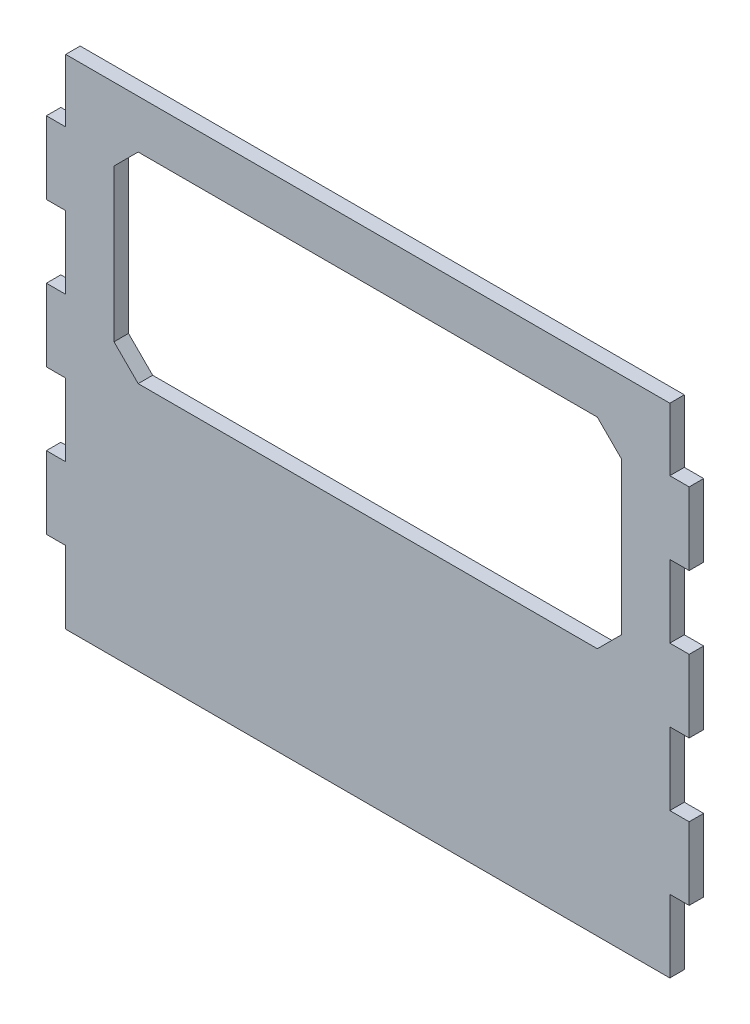
ISO-10303-21;
HEADER;
FILE_DESCRIPTION(('STEP AP214'),'2;1');
FILE_NAME('part.step','',(''),(''),'','','');
FILE_SCHEMA(('AUTOMOTIVE_DESIGN { 1 0 10303 214 1 1 1 1 }'));
ENDSEC;
DATA;
#1=APPLICATION_CONTEXT('core data for automotive mechanical design processes');
#2=APPLICATION_PROTOCOL_DEFINITION('international standard','automotive_design',2000,#1);
#3=PRODUCT_CONTEXT('',#1,'mechanical');
#4=PRODUCT('Part','Part','',(#3));
#5=PRODUCT_RELATED_PRODUCT_CATEGORY('part','',(#4));
#6=PRODUCT_DEFINITION_FORMATION('','',#4);
#7=PRODUCT_DEFINITION_CONTEXT('part definition',#1,'design');
#8=PRODUCT_DEFINITION('design','',#6,#7);
#9=PRODUCT_DEFINITION_SHAPE('','',#8);
#10=(LENGTH_UNIT() NAMED_UNIT(*) SI_UNIT(.MILLI.,.METRE.));
#11=(NAMED_UNIT(*) PLANE_ANGLE_UNIT() SI_UNIT($,.RADIAN.));
#12=(NAMED_UNIT(*) SI_UNIT($,.STERADIAN.) SOLID_ANGLE_UNIT());
#13=UNCERTAINTY_MEASURE_WITH_UNIT(LENGTH_MEASURE(1.E-05),#10,'distance_accuracy_value','');
#14=(GEOMETRIC_REPRESENTATION_CONTEXT(3) GLOBAL_UNCERTAINTY_ASSIGNED_CONTEXT((#13)) GLOBAL_UNIT_ASSIGNED_CONTEXT((#10,
#11,#12)) REPRESENTATION_CONTEXT('',''));
#15=CARTESIAN_POINT('',(0.,0.,0.));
#16=DIRECTION('',(0.,0.,1.));
#17=DIRECTION('',(1.,0.,0.));
#18=AXIS2_PLACEMENT_3D('',#15,#16,#17);
#19=CARTESIAN_POINT('',(0.,0.,3.));
#20=DIRECTION('',(-1.,0.,0.));
#21=DIRECTION('',(0.,0.,1.));
#22=AXIS2_PLACEMENT_3D('',#19,#20,#21);
#23=PLANE('',#22);
#24=DIRECTION('',(0.,0.,1.));
#25=VECTOR('',#24,1.);
#26=CARTESIAN_POINT('',(0.,90.,0.));
#27=LINE('',#26,#25);
#28=CARTESIAN_POINT('',(0.,90.,0.));
#29=VERTEX_POINT('',#28);
#30=CARTESIAN_POINT('',(0.,90.,3.));
#31=VERTEX_POINT('',#30);
#32=EDGE_CURVE('E361',#29,#31,#27,.T.);
#33=ORIENTED_EDGE('',*,*,#32,.F.);
#34=DIRECTION('',(0.,1.,0.));
#35=VECTOR('',#34,1.);
#36=CARTESIAN_POINT('',(0.,0.,0.));
#37=LINE('',#36,#35);
#38=CARTESIAN_POINT('',(0.,103.,0.));
#39=VERTEX_POINT('',#38);
#40=EDGE_CURVE('E317',#29,#39,#37,.T.);
#41=ORIENTED_EDGE('',*,*,#40,.T.);
#42=DIRECTION('',(0.,0.,-1.));
#43=VECTOR('',#42,1.);
#44=CARTESIAN_POINT('',(0.,103.,3.));
#45=LINE('',#44,#43);
#46=CARTESIAN_POINT('',(0.,103.,3.));
#47=VERTEX_POINT('',#46);
#48=EDGE_CURVE('E11',#47,#39,#45,.T.);
#49=ORIENTED_EDGE('',*,*,#48,.F.);
#50=DIRECTION('',(0.,1.,0.));
#51=VECTOR('',#50,1.);
#52=CARTESIAN_POINT('',(0.,0.,3.));
#53=LINE('',#52,#51);
#54=EDGE_CURVE('E326',#31,#47,#53,.T.);
#55=ORIENTED_EDGE('',*,*,#54,.F.);
#56=EDGE_LOOP('',(#33,#41,#49,#55));
#57=FACE_BOUND('',#56,.T.);
#58=ADVANCED_FACE('F38',(#57),#23,.F.);
#59=CARTESIAN_POINT('',(0.,60.,0.));
#60=VERTEX_POINT('',#59);
#61=CARTESIAN_POINT('',(0.,75.,0.));
#62=VERTEX_POINT('',#61);
#63=EDGE_CURVE('E550',#60,#62,#37,.T.);
#64=ORIENTED_EDGE('',*,*,#63,.T.);
#65=DIRECTION('',(0.,0.,1.));
#66=VECTOR('',#65,1.);
#67=CARTESIAN_POINT('',(0.,75.,0.));
#68=LINE('',#67,#66);
#69=CARTESIAN_POINT('',(0.,75.,3.));
#70=VERTEX_POINT('',#69);
#71=EDGE_CURVE('E363',#62,#70,#68,.T.);
#72=ORIENTED_EDGE('',*,*,#71,.T.);
#73=CARTESIAN_POINT('',(0.,60.,3.));
#74=VERTEX_POINT('',#73);
#75=EDGE_CURVE('E540',#74,#70,#53,.T.);
#76=ORIENTED_EDGE('',*,*,#75,.F.);
#77=DIRECTION('',(0.,0.,1.));
#78=VECTOR('',#77,1.);
#79=CARTESIAN_POINT('',(0.,60.,0.));
#80=LINE('',#79,#78);
#81=EDGE_CURVE('E374',#60,#74,#80,.T.);
#82=ORIENTED_EDGE('',*,*,#81,.F.);
#83=EDGE_LOOP('',(#64,#72,#76,#82));
#84=FACE_BOUND('',#83,.T.);
#85=ADVANCED_FACE('F548',(#84),#23,.F.);
#86=CARTESIAN_POINT('',(0.,30.,0.));
#87=VERTEX_POINT('',#86);
#88=CARTESIAN_POINT('',(0.,45.,0.));
#89=VERTEX_POINT('',#88);
#90=EDGE_CURVE('E316',#87,#89,#37,.T.);
#91=ORIENTED_EDGE('',*,*,#90,.T.);
#92=DIRECTION('',(0.,0.,1.));
#93=VECTOR('',#92,1.);
#94=CARTESIAN_POINT('',(0.,45.,0.));
#95=LINE('',#94,#93);
#96=CARTESIAN_POINT('',(0.,45.,3.));
#97=VERTEX_POINT('',#96);
#98=EDGE_CURVE('E431',#89,#97,#95,.T.);
#99=ORIENTED_EDGE('',*,*,#98,.T.);
#100=CARTESIAN_POINT('',(0.,30.,3.));
#101=VERTEX_POINT('',#100);
#102=EDGE_CURVE('E537',#101,#97,#53,.T.);
#103=ORIENTED_EDGE('',*,*,#102,.F.);
#104=DIRECTION('',(0.,0.,1.));
#105=VECTOR('',#104,1.);
#106=CARTESIAN_POINT('',(0.,30.,0.));
#107=LINE('',#106,#105);
#108=EDGE_CURVE('E470',#87,#101,#107,.T.);
#109=ORIENTED_EDGE('',*,*,#108,.F.);
#110=EDGE_LOOP('',(#91,#99,#103,#109));
#111=FACE_BOUND('',#110,.T.);
#112=ADVANCED_FACE('F609',(#111),#23,.F.);
#113=CARTESIAN_POINT('',(-125.,0.,3.));
#114=DIRECTION('',(1.,0.,0.));
#115=DIRECTION('',(0.,0.,-1.));
#116=AXIS2_PLACEMENT_3D('',#113,#114,#115);
#117=PLANE('',#116);
#118=DIRECTION('',(0.,0.,1.));
#119=VECTOR('',#118,1.);
#120=CARTESIAN_POINT('',(-125.,45.,0.));
#121=LINE('',#120,#119);
#122=CARTESIAN_POINT('',(-125.,45.,0.));
#123=VERTEX_POINT('',#122);
#124=CARTESIAN_POINT('',(-125.,45.,3.));
#125=VERTEX_POINT('',#124);
#126=EDGE_CURVE('E381',#123,#125,#121,.T.);
#127=ORIENTED_EDGE('',*,*,#126,.F.);
#128=DIRECTION('',(0.,-1.,0.));
#129=VECTOR('',#128,1.);
#130=CARTESIAN_POINT('',(-125.,0.,0.));
#131=LINE('',#130,#129);
#132=CARTESIAN_POINT('',(-125.,30.0000000000001,0.));
#133=VERTEX_POINT('',#132);
#134=EDGE_CURVE('E576',#123,#133,#131,.T.);
#135=ORIENTED_EDGE('',*,*,#134,.T.);
#136=DIRECTION('',(0.,0.,1.));
#137=VECTOR('',#136,1.);
#138=CARTESIAN_POINT('',(-125.,30.0000000000001,0.));
#139=LINE('',#138,#137);
#140=CARTESIAN_POINT('',(-125.,30.,3.));
#141=VERTEX_POINT('',#140);
#142=EDGE_CURVE('E407',#133,#141,#139,.T.);
#143=ORIENTED_EDGE('',*,*,#142,.T.);
#144=DIRECTION('',(0.,-1.,0.));
#145=VECTOR('',#144,1.);
#146=CARTESIAN_POINT('',(-125.,0.,3.));
#147=LINE('',#146,#145);
#148=EDGE_CURVE('E300',#125,#141,#147,.T.);
#149=ORIENTED_EDGE('',*,*,#148,.F.);
#150=EDGE_LOOP('',(#127,#135,#143,#149));
#151=FACE_BOUND('',#150,.T.);
#152=ADVANCED_FACE('F639',(#151),#117,.F.);
#153=DIRECTION('',(0.,0.,1.));
#154=VECTOR('',#153,1.);
#155=CARTESIAN_POINT('',(-125.,15.0000000000001,0.));
#156=LINE('',#155,#154);
#157=CARTESIAN_POINT('',(-125.,15.0000000000001,0.));
#158=VERTEX_POINT('',#157);
#159=CARTESIAN_POINT('',(-125.,15.0000000000001,3.));
#160=VERTEX_POINT('',#159);
#161=EDGE_CURVE('E404',#158,#160,#156,.T.);
#162=ORIENTED_EDGE('',*,*,#161,.F.);
#163=CARTESIAN_POINT('',(-125.,0.,0.));
#164=VERTEX_POINT('',#163);
#165=EDGE_CURVE('E319',#158,#164,#131,.T.);
#166=ORIENTED_EDGE('',*,*,#165,.T.);
#167=DIRECTION('',(0.,0.,-1.));
#168=VECTOR('',#167,1.);
#169=CARTESIAN_POINT('',(-125.,0.,3.));
#170=LINE('',#169,#168);
#171=CARTESIAN_POINT('',(-125.,0.,3.));
#172=VERTEX_POINT('',#171);
#173=EDGE_CURVE('E329',#172,#164,#170,.T.);
#174=ORIENTED_EDGE('',*,*,#173,.F.);
#175=EDGE_CURVE('E304',#160,#172,#147,.T.);
#176=ORIENTED_EDGE('',*,*,#175,.F.);
#177=EDGE_LOOP('',(#162,#166,#174,#176));
#178=FACE_BOUND('',#177,.T.);
#179=ADVANCED_FACE('F585',(#178),#117,.F.);
#180=CARTESIAN_POINT('',(-125.,75.,0.));
#181=VERTEX_POINT('',#180);
#182=CARTESIAN_POINT('',(-125.,60.,0.));
#183=VERTEX_POINT('',#182);
#184=EDGE_CURVE('E324',#181,#183,#131,.T.);
#185=ORIENTED_EDGE('',*,*,#184,.T.);
#186=DIRECTION('',(0.,0.,1.));
#187=VECTOR('',#186,1.);
#188=CARTESIAN_POINT('',(-125.,60.,0.));
#189=LINE('',#188,#187);
#190=CARTESIAN_POINT('',(-125.,60.,3.));
#191=VERTEX_POINT('',#190);
#192=EDGE_CURVE('E298',#183,#191,#189,.T.);
#193=ORIENTED_EDGE('',*,*,#192,.T.);
#194=CARTESIAN_POINT('',(-125.,75.,3.));
#195=VERTEX_POINT('',#194);
#196=EDGE_CURVE('E290',#195,#191,#147,.T.);
#197=ORIENTED_EDGE('',*,*,#196,.F.);
#198=DIRECTION('',(0.,0.,1.));
#199=VECTOR('',#198,1.);
#200=CARTESIAN_POINT('',(-125.,75.,0.));
#201=LINE('',#200,#199);
#202=EDGE_CURVE('E271',#181,#195,#201,.T.);
#203=ORIENTED_EDGE('',*,*,#202,.F.);
#204=EDGE_LOOP('',(#185,#193,#197,#203));
#205=FACE_BOUND('',#204,.T.);
#206=ADVANCED_FACE('F297',(#205),#117,.F.);
#207=CARTESIAN_POINT('',(0.,0.,3.));
#208=DIRECTION('',(0.,0.,1.));
#209=DIRECTION('',(1.,0.,0.));
#210=AXIS2_PLACEMENT_3D('',#207,#208,#209);
#211=PLANE('',#210);
#212=CARTESIAN_POINT('',(0.,0.,3.));
#213=VERTEX_POINT('',#212);
#214=CARTESIAN_POINT('',(0.,15.,3.));
#215=VERTEX_POINT('',#214);
#216=EDGE_CURVE('E536',#213,#215,#53,.T.);
#217=ORIENTED_EDGE('',*,*,#216,.T.);
#218=DIRECTION('',(1.,0.,0.));
#219=VECTOR('',#218,1.);
#220=CARTESIAN_POINT('',(0.,15.,3.));
#221=LINE('',#220,#219);
#222=CARTESIAN_POINT('',(4.,15.,3.));
#223=VERTEX_POINT('',#222);
#224=EDGE_CURVE('E424',#215,#223,#221,.T.);
#225=ORIENTED_EDGE('',*,*,#224,.T.);
#226=DIRECTION('',(0.,1.,0.));
#227=VECTOR('',#226,1.);
#228=CARTESIAN_POINT('',(4.,15.,3.));
#229=LINE('',#228,#227);
#230=CARTESIAN_POINT('',(4.,30.,3.));
#231=VERTEX_POINT('',#230);
#232=EDGE_CURVE('E465',#223,#231,#229,.T.);
#233=ORIENTED_EDGE('',*,*,#232,.T.);
#234=DIRECTION('',(-1.,0.,0.));
#235=VECTOR('',#234,1.);
#236=CARTESIAN_POINT('',(0.,30.,3.));
#237=LINE('',#236,#235);
#238=EDGE_CURVE('E457',#231,#101,#237,.T.);
#239=ORIENTED_EDGE('',*,*,#238,.T.);
#240=ORIENTED_EDGE('',*,*,#102,.T.);
#241=DIRECTION('',(1.,0.,0.));
#242=VECTOR('',#241,1.);
#243=CARTESIAN_POINT('',(0.,45.,3.));
#244=LINE('',#243,#242);
#245=CARTESIAN_POINT('',(4.,45.,3.));
#246=VERTEX_POINT('',#245);
#247=EDGE_CURVE('E61',#97,#246,#244,.T.);
#248=ORIENTED_EDGE('',*,*,#247,.T.);
#249=DIRECTION('',(0.,1.,0.));
#250=VECTOR('',#249,1.);
#251=CARTESIAN_POINT('',(4.,45.,3.));
#252=LINE('',#251,#250);
#253=CARTESIAN_POINT('',(4.,60.,3.));
#254=VERTEX_POINT('',#253);
#255=EDGE_CURVE('E442',#246,#254,#252,.T.);
#256=ORIENTED_EDGE('',*,*,#255,.T.);
#257=DIRECTION('',(-1.,0.,0.));
#258=VECTOR('',#257,1.);
#259=CARTESIAN_POINT('',(0.,60.,3.));
#260=LINE('',#259,#258);
#261=EDGE_CURVE('E439',#254,#74,#260,.T.);
#262=ORIENTED_EDGE('',*,*,#261,.T.);
#263=ORIENTED_EDGE('',*,*,#75,.T.);
#264=DIRECTION('',(1.,0.,0.));
#265=VECTOR('',#264,1.);
#266=CARTESIAN_POINT('',(0.,75.,3.));
#267=LINE('',#266,#265);
#268=CARTESIAN_POINT('',(4.,75.,3.));
#269=VERTEX_POINT('',#268);
#270=EDGE_CURVE('E53',#70,#269,#267,.T.);
#271=ORIENTED_EDGE('',*,*,#270,.T.);
#272=DIRECTION('',(0.,1.,0.));
#273=VECTOR('',#272,1.);
#274=CARTESIAN_POINT('',(4.,75.,3.));
#275=LINE('',#274,#273);
#276=CARTESIAN_POINT('',(4.,90.,3.));
#277=VERTEX_POINT('',#276);
#278=EDGE_CURVE('E369',#269,#277,#275,.T.);
#279=ORIENTED_EDGE('',*,*,#278,.T.);
#280=DIRECTION('',(-1.,0.,0.));
#281=VECTOR('',#280,1.);
#282=CARTESIAN_POINT('',(0.,90.,3.));
#283=LINE('',#282,#281);
#284=EDGE_CURVE('E366',#277,#31,#283,.T.);
#285=ORIENTED_EDGE('',*,*,#284,.T.);
#286=ORIENTED_EDGE('',*,*,#54,.T.);
#287=DIRECTION('',(-1.,0.,0.));
#288=VECTOR('',#287,1.);
#289=CARTESIAN_POINT('',(0.,103.,3.));
#290=LINE('',#289,#288);
#291=CARTESIAN_POINT('',(-125.,103.,3.));
#292=VERTEX_POINT('',#291);
#293=EDGE_CURVE('E308',#47,#292,#290,.T.);
#294=ORIENTED_EDGE('',*,*,#293,.T.);
#295=CARTESIAN_POINT('',(-125.,90.,3.));
#296=VERTEX_POINT('',#295);
#297=EDGE_CURVE('E299',#292,#296,#147,.T.);
#298=ORIENTED_EDGE('',*,*,#297,.T.);
#299=DIRECTION('',(-1.,0.,0.));
#300=VECTOR('',#299,1.);
#301=CARTESIAN_POINT('',(-125.,90.,3.));
#302=LINE('',#301,#300);
#303=CARTESIAN_POINT('',(-129.,90.,3.));
#304=VERTEX_POINT('',#303);
#305=EDGE_CURVE('E389',#296,#304,#302,.T.);
#306=ORIENTED_EDGE('',*,*,#305,.T.);
#307=DIRECTION('',(0.,-1.,0.));
#308=VECTOR('',#307,1.);
#309=CARTESIAN_POINT('',(-129.,75.,3.));
#310=LINE('',#309,#308);
#311=CARTESIAN_POINT('',(-129.,75.,3.));
#312=VERTEX_POINT('',#311);
#313=EDGE_CURVE('E293',#304,#312,#310,.T.);
#314=ORIENTED_EDGE('',*,*,#313,.T.);
#315=DIRECTION('',(1.,0.,0.));
#316=VECTOR('',#315,1.);
#317=CARTESIAN_POINT('',(-125.,75.,3.));
#318=LINE('',#317,#316);
#319=EDGE_CURVE('E274',#312,#195,#318,.T.);
#320=ORIENTED_EDGE('',*,*,#319,.T.);
#321=ORIENTED_EDGE('',*,*,#196,.T.);
#322=DIRECTION('',(-1.,0.,0.));
#323=VECTOR('',#322,1.);
#324=CARTESIAN_POINT('',(-125.,60.,3.));
#325=LINE('',#324,#323);
#326=CARTESIAN_POINT('',(-129.,60.,3.));
#327=VERTEX_POINT('',#326);
#328=EDGE_CURVE('E393',#191,#327,#325,.T.);
#329=ORIENTED_EDGE('',*,*,#328,.T.);
#330=DIRECTION('',(0.,-1.,0.));
#331=VECTOR('',#330,1.);
#332=CARTESIAN_POINT('',(-129.,45.,3.));
#333=LINE('',#332,#331);
#334=CARTESIAN_POINT('',(-129.,45.,3.));
#335=VERTEX_POINT('',#334);
#336=EDGE_CURVE('E390',#327,#335,#333,.T.);
#337=ORIENTED_EDGE('',*,*,#336,.T.);
#338=DIRECTION('',(1.,0.,0.));
#339=VECTOR('',#338,1.);
#340=CARTESIAN_POINT('',(-125.,45.,3.));
#341=LINE('',#340,#339);
#342=EDGE_CURVE('E365',#335,#125,#341,.T.);
#343=ORIENTED_EDGE('',*,*,#342,.T.);
#344=ORIENTED_EDGE('',*,*,#148,.T.);
#345=DIRECTION('',(-1.,0.,0.));
#346=VECTOR('',#345,1.);
#347=CARTESIAN_POINT('',(-125.,30.0000000000001,3.));
#348=LINE('',#347,#346);
#349=CARTESIAN_POINT('',(-129.,30.0000000000001,3.));
#350=VERTEX_POINT('',#349);
#351=EDGE_CURVE('E417',#141,#350,#348,.T.);
#352=ORIENTED_EDGE('',*,*,#351,.T.);
#353=DIRECTION('',(0.,-1.,0.));
#354=VECTOR('',#353,1.);
#355=CARTESIAN_POINT('',(-129.,15.0000000000001,3.));
#356=LINE('',#355,#354);
#357=CARTESIAN_POINT('',(-129.,15.0000000000001,3.));
#358=VERTEX_POINT('',#357);
#359=EDGE_CURVE('E414',#350,#358,#356,.T.);
#360=ORIENTED_EDGE('',*,*,#359,.T.);
#361=DIRECTION('',(1.,0.,0.));
#362=VECTOR('',#361,1.);
#363=CARTESIAN_POINT('',(-125.,15.0000000000001,3.));
#364=LINE('',#363,#362);
#365=EDGE_CURVE('E421',#358,#160,#364,.T.);
#366=ORIENTED_EDGE('',*,*,#365,.T.);
#367=ORIENTED_EDGE('',*,*,#175,.T.);
#368=DIRECTION('',(1.,0.,0.));
#369=VECTOR('',#368,1.);
#370=CARTESIAN_POINT('',(0.,0.,3.));
#371=LINE('',#370,#369);
#372=EDGE_CURVE('E303',#172,#213,#371,.T.);
#373=ORIENTED_EDGE('',*,*,#372,.T.);
#374=EDGE_LOOP('',(#217,#225,#233,#239,#240,#248,#256,#262,#263,#271,#279,#285,#286,#294,#298,
#306,#314,#320,#321,#329,#337,#343,#344,#352,#360,#366,#367,#373));
#375=FACE_BOUND('',#374,.T.);
#376=DIRECTION('',(0.,-1.,0.));
#377=VECTOR('',#376,1.);
#378=CARTESIAN_POINT('',(-115.,56.5,3.));
#379=LINE('',#378,#377);
#380=CARTESIAN_POINT('',(-115.,88.,3.));
#381=VERTEX_POINT('',#380);
#382=CARTESIAN_POINT('',(-115.,56.5,3.));
#383=VERTEX_POINT('',#382);
#384=EDGE_CURVE('E481',#381,#383,#379,.T.);
#385=ORIENTED_EDGE('',*,*,#384,.F.);
#386=DIRECTION('',(-0.707106781186547,-0.707106781186547,0.));
#387=VECTOR('',#386,1.);
#388=CARTESIAN_POINT('',(-110.,93.,3.));
#389=LINE('',#388,#387);
#390=CARTESIAN_POINT('',(-110.,93.,3.));
#391=VERTEX_POINT('',#390);
#392=EDGE_CURVE('E479',#391,#381,#389,.T.);
#393=ORIENTED_EDGE('',*,*,#392,.F.);
#394=DIRECTION('',(-1.,0.,0.));
#395=VECTOR('',#394,1.);
#396=CARTESIAN_POINT('',(-15.,93.,3.));
#397=LINE('',#396,#395);
#398=CARTESIAN_POINT('',(-15.,93.,3.));
#399=VERTEX_POINT('',#398);
#400=EDGE_CURVE('E495',#399,#391,#397,.T.);
#401=ORIENTED_EDGE('',*,*,#400,.F.);
#402=DIRECTION('',(-0.707106781186547,0.707106781186548,0.));
#403=VECTOR('',#402,1.);
#404=CARTESIAN_POINT('',(-10.,88.,3.));
#405=LINE('',#404,#403);
#406=CARTESIAN_POINT('',(-10.,88.,3.));
#407=VERTEX_POINT('',#406);
#408=EDGE_CURVE('E492',#407,#399,#405,.T.);
#409=ORIENTED_EDGE('',*,*,#408,.F.);
#410=DIRECTION('',(0.,1.,0.));
#411=VECTOR('',#410,1.);
#412=CARTESIAN_POINT('',(-10.,56.5,3.));
#413=LINE('',#412,#411);
#414=CARTESIAN_POINT('',(-10.,56.5,3.));
#415=VERTEX_POINT('',#414);
#416=EDGE_CURVE('E490',#415,#407,#413,.T.);
#417=ORIENTED_EDGE('',*,*,#416,.F.);
#418=DIRECTION('',(0.707106781186548,0.707106781186547,0.));
#419=VECTOR('',#418,1.);
#420=CARTESIAN_POINT('',(-15.,51.5,3.));
#421=LINE('',#420,#419);
#422=CARTESIAN_POINT('',(-15.,51.5,3.));
#423=VERTEX_POINT('',#422);
#424=EDGE_CURVE('E488',#423,#415,#421,.T.);
#425=ORIENTED_EDGE('',*,*,#424,.F.);
#426=DIRECTION('',(1.,0.,0.));
#427=VECTOR('',#426,1.);
#428=CARTESIAN_POINT('',(-110.,51.5,3.));
#429=LINE('',#428,#427);
#430=CARTESIAN_POINT('',(-110.,51.5,3.));
#431=VERTEX_POINT('',#430);
#432=EDGE_CURVE('E486',#431,#423,#429,.T.);
#433=ORIENTED_EDGE('',*,*,#432,.F.);
#434=DIRECTION('',(0.707106781186548,-0.707106781186547,0.));
#435=VECTOR('',#434,1.);
#436=CARTESIAN_POINT('',(-115.,56.5,3.));
#437=LINE('',#436,#435);
#438=EDGE_CURVE('E484',#383,#431,#437,.T.);
#439=ORIENTED_EDGE('',*,*,#438,.F.);
#440=EDGE_LOOP('',(#385,#393,#401,#409,#417,#425,#433,#439));
#441=FACE_BOUND('',#440,.T.);
#442=ADVANCED_FACE('F287',(#375,#441),#211,.T.);
#443=CARTESIAN_POINT('',(0.,0.,0.));
#444=DIRECTION('',(0.,0.,1.));
#445=DIRECTION('',(1.,0.,0.));
#446=AXIS2_PLACEMENT_3D('',#443,#444,#445);
#447=PLANE('',#446);
#448=CARTESIAN_POINT('',(0.,0.,0.));
#449=VERTEX_POINT('',#448);
#450=CARTESIAN_POINT('',(0.,15.,0.));
#451=VERTEX_POINT('',#450);
#452=EDGE_CURVE('E312',#449,#451,#37,.T.);
#453=ORIENTED_EDGE('',*,*,#452,.F.);
#454=DIRECTION('',(1.,0.,0.));
#455=VECTOR('',#454,1.);
#456=CARTESIAN_POINT('',(0.,0.,0.));
#457=LINE('',#456,#455);
#458=EDGE_CURVE('E323',#164,#449,#457,.T.);
#459=ORIENTED_EDGE('',*,*,#458,.F.);
#460=ORIENTED_EDGE('',*,*,#165,.F.);
#461=DIRECTION('',(1.,0.,0.));
#462=VECTOR('',#461,1.);
#463=CARTESIAN_POINT('',(-125.,15.0000000000001,0.));
#464=LINE('',#463,#462);
#465=CARTESIAN_POINT('',(-129.,15.0000000000001,0.));
#466=VERTEX_POINT('',#465);
#467=EDGE_CURVE('E418',#466,#158,#464,.T.);
#468=ORIENTED_EDGE('',*,*,#467,.F.);
#469=DIRECTION('',(0.,-1.,0.));
#470=VECTOR('',#469,1.);
#471=CARTESIAN_POINT('',(-129.,15.0000000000001,0.));
#472=LINE('',#471,#470);
#473=CARTESIAN_POINT('',(-129.,30.0000000000001,0.));
#474=VERTEX_POINT('',#473);
#475=EDGE_CURVE('E406',#474,#466,#472,.T.);
#476=ORIENTED_EDGE('',*,*,#475,.F.);
#477=DIRECTION('',(-1.,0.,0.));
#478=VECTOR('',#477,1.);
#479=CARTESIAN_POINT('',(-125.,30.0000000000001,0.));
#480=LINE('',#479,#478);
#481=EDGE_CURVE('E427',#133,#474,#480,.T.);
#482=ORIENTED_EDGE('',*,*,#481,.F.);
#483=ORIENTED_EDGE('',*,*,#134,.F.);
#484=DIRECTION('',(1.,0.,0.));
#485=VECTOR('',#484,1.);
#486=CARTESIAN_POINT('',(-125.,45.,0.));
#487=LINE('',#486,#485);
#488=CARTESIAN_POINT('',(-129.,45.,0.));
#489=VERTEX_POINT('',#488);
#490=EDGE_CURVE('E394',#489,#123,#487,.T.);
#491=ORIENTED_EDGE('',*,*,#490,.F.);
#492=DIRECTION('',(0.,-1.,0.));
#493=VECTOR('',#492,1.);
#494=CARTESIAN_POINT('',(-129.,45.,0.));
#495=LINE('',#494,#493);
#496=CARTESIAN_POINT('',(-129.,60.,0.));
#497=VERTEX_POINT('',#496);
#498=EDGE_CURVE('E383',#497,#489,#495,.T.);
#499=ORIENTED_EDGE('',*,*,#498,.F.);
#500=DIRECTION('',(-1.,0.,0.));
#501=VECTOR('',#500,1.);
#502=CARTESIAN_POINT('',(-125.,60.,0.));
#503=LINE('',#502,#501);
#504=EDGE_CURVE('E400',#183,#497,#503,.T.);
#505=ORIENTED_EDGE('',*,*,#504,.F.);
#506=ORIENTED_EDGE('',*,*,#184,.F.);
#507=DIRECTION('',(1.,0.,0.));
#508=VECTOR('',#507,1.);
#509=CARTESIAN_POINT('',(-125.,75.,0.));
#510=LINE('',#509,#508);
#511=CARTESIAN_POINT('',(-129.,75.,0.));
#512=VERTEX_POINT('',#511);
#513=EDGE_CURVE('E276',#512,#181,#510,.T.);
#514=ORIENTED_EDGE('',*,*,#513,.F.);
#515=DIRECTION('',(0.,-1.,0.));
#516=VECTOR('',#515,1.);
#517=CARTESIAN_POINT('',(-129.,75.,0.));
#518=LINE('',#517,#516);
#519=CARTESIAN_POINT('',(-129.,90.,0.));
#520=VERTEX_POINT('',#519);
#521=EDGE_CURVE('E350',#520,#512,#518,.T.);
#522=ORIENTED_EDGE('',*,*,#521,.F.);
#523=DIRECTION('',(-1.,0.,0.));
#524=VECTOR('',#523,1.);
#525=CARTESIAN_POINT('',(-125.,90.,0.));
#526=LINE('',#525,#524);
#527=CARTESIAN_POINT('',(-125.,90.,0.));
#528=VERTEX_POINT('',#527);
#529=EDGE_CURVE('E294',#528,#520,#526,.T.);
#530=ORIENTED_EDGE('',*,*,#529,.F.);
#531=CARTESIAN_POINT('',(-125.,103.,0.));
#532=VERTEX_POINT('',#531);
#533=EDGE_CURVE('E320',#532,#528,#131,.T.);
#534=ORIENTED_EDGE('',*,*,#533,.F.);
#535=DIRECTION('',(-1.,0.,0.));
#536=VECTOR('',#535,1.);
#537=CARTESIAN_POINT('',(0.,103.,0.));
#538=LINE('',#537,#536);
#539=EDGE_CURVE('E315',#39,#532,#538,.T.);
#540=ORIENTED_EDGE('',*,*,#539,.F.);
#541=ORIENTED_EDGE('',*,*,#40,.F.);
#542=DIRECTION('',(-1.,0.,0.));
#543=VECTOR('',#542,1.);
#544=CARTESIAN_POINT('',(0.,90.,0.));
#545=LINE('',#544,#543);
#546=CARTESIAN_POINT('',(4.,90.,0.));
#547=VERTEX_POINT('',#546);
#548=EDGE_CURVE('E358',#547,#29,#545,.T.);
#549=ORIENTED_EDGE('',*,*,#548,.F.);
#550=DIRECTION('',(0.,1.,0.));
#551=VECTOR('',#550,1.);
#552=CARTESIAN_POINT('',(4.,75.,0.));
#553=LINE('',#552,#551);
#554=CARTESIAN_POINT('',(4.,75.,0.));
#555=VERTEX_POINT('',#554);
#556=EDGE_CURVE('E376',#555,#547,#553,.T.);
#557=ORIENTED_EDGE('',*,*,#556,.F.);
#558=DIRECTION('',(1.,0.,0.));
#559=VECTOR('',#558,1.);
#560=CARTESIAN_POINT('',(0.,75.,0.));
#561=LINE('',#560,#559);
#562=EDGE_CURVE('E370',#62,#555,#561,.T.);
#563=ORIENTED_EDGE('',*,*,#562,.F.);
#564=ORIENTED_EDGE('',*,*,#63,.F.);
#565=DIRECTION('',(-1.,0.,0.));
#566=VECTOR('',#565,1.);
#567=CARTESIAN_POINT('',(0.,60.,0.));
#568=LINE('',#567,#566);
#569=CARTESIAN_POINT('',(4.,60.,0.));
#570=VERTEX_POINT('',#569);
#571=EDGE_CURVE('E433',#570,#60,#568,.T.);
#572=ORIENTED_EDGE('',*,*,#571,.F.);
#573=DIRECTION('',(0.,1.,0.));
#574=VECTOR('',#573,1.);
#575=CARTESIAN_POINT('',(4.,45.,0.));
#576=LINE('',#575,#574);
#577=CARTESIAN_POINT('',(4.,45.,0.));
#578=VERTEX_POINT('',#577);
#579=EDGE_CURVE('E448',#578,#570,#576,.T.);
#580=ORIENTED_EDGE('',*,*,#579,.F.);
#581=DIRECTION('',(1.,0.,0.));
#582=VECTOR('',#581,1.);
#583=CARTESIAN_POINT('',(0.,45.,0.));
#584=LINE('',#583,#582);
#585=EDGE_CURVE('E443',#89,#578,#584,.T.);
#586=ORIENTED_EDGE('',*,*,#585,.F.);
#587=ORIENTED_EDGE('',*,*,#90,.F.);
#588=DIRECTION('',(-1.,0.,0.));
#589=VECTOR('',#588,1.);
#590=CARTESIAN_POINT('',(0.,30.,0.));
#591=LINE('',#590,#589);
#592=CARTESIAN_POINT('',(4.,30.,0.));
#593=VERTEX_POINT('',#592);
#594=EDGE_CURVE('E460',#593,#87,#591,.T.);
#595=ORIENTED_EDGE('',*,*,#594,.F.);
#596=DIRECTION('',(0.,1.,0.));
#597=VECTOR('',#596,1.);
#598=CARTESIAN_POINT('',(4.,15.,0.));
#599=LINE('',#598,#597);
#600=CARTESIAN_POINT('',(4.,15.,0.));
#601=VERTEX_POINT('',#600);
#602=EDGE_CURVE('E456',#601,#593,#599,.T.);
#603=ORIENTED_EDGE('',*,*,#602,.F.);
#604=DIRECTION('',(1.,0.,0.));
#605=VECTOR('',#604,1.);
#606=CARTESIAN_POINT('',(0.,15.,0.));
#607=LINE('',#606,#605);
#608=EDGE_CURVE('E453',#451,#601,#607,.T.);
#609=ORIENTED_EDGE('',*,*,#608,.F.);
#610=EDGE_LOOP('',(#453,#459,#460,#468,#476,#482,#483,#491,#499,#505,#506,#514,#522,#530,#534,
#540,#541,#549,#557,#563,#564,#572,#580,#586,#587,#595,#603,#609));
#611=FACE_BOUND('',#610,.T.);
#612=DIRECTION('',(-0.707106781186547,-0.707106781186547,0.));
#613=VECTOR('',#612,1.);
#614=CARTESIAN_POINT('',(-110.,93.,0.));
#615=LINE('',#614,#613);
#616=CARTESIAN_POINT('',(-110.,93.,0.));
#617=VERTEX_POINT('',#616);
#618=CARTESIAN_POINT('',(-115.,88.,0.));
#619=VERTEX_POINT('',#618);
#620=EDGE_CURVE('E472',#617,#619,#615,.T.);
#621=ORIENTED_EDGE('',*,*,#620,.T.);
#622=DIRECTION('',(0.,-1.,0.));
#623=VECTOR('',#622,1.);
#624=CARTESIAN_POINT('',(-115.,56.5,0.));
#625=LINE('',#624,#623);
#626=CARTESIAN_POINT('',(-115.,56.5,0.));
#627=VERTEX_POINT('',#626);
#628=EDGE_CURVE('E500',#619,#627,#625,.T.);
#629=ORIENTED_EDGE('',*,*,#628,.T.);
#630=DIRECTION('',(0.707106781186548,-0.707106781186547,0.));
#631=VECTOR('',#630,1.);
#632=CARTESIAN_POINT('',(-115.,56.5,0.));
#633=LINE('',#632,#631);
#634=CARTESIAN_POINT('',(-110.,51.5,0.));
#635=VERTEX_POINT('',#634);
#636=EDGE_CURVE('E503',#627,#635,#633,.T.);
#637=ORIENTED_EDGE('',*,*,#636,.T.);
#638=DIRECTION('',(1.,0.,0.));
#639=VECTOR('',#638,1.);
#640=CARTESIAN_POINT('',(-110.,51.5,0.));
#641=LINE('',#640,#639);
#642=CARTESIAN_POINT('',(-15.,51.5,0.));
#643=VERTEX_POINT('',#642);
#644=EDGE_CURVE('E506',#635,#643,#641,.T.);
#645=ORIENTED_EDGE('',*,*,#644,.T.);
#646=DIRECTION('',(0.707106781186548,0.707106781186547,0.));
#647=VECTOR('',#646,1.);
#648=CARTESIAN_POINT('',(-15.,51.5,0.));
#649=LINE('',#648,#647);
#650=CARTESIAN_POINT('',(-10.,56.5,0.));
#651=VERTEX_POINT('',#650);
#652=EDGE_CURVE('E509',#643,#651,#649,.T.);
#653=ORIENTED_EDGE('',*,*,#652,.T.);
#654=DIRECTION('',(0.,1.,0.));
#655=VECTOR('',#654,1.);
#656=CARTESIAN_POINT('',(-10.,56.5,0.));
#657=LINE('',#656,#655);
#658=CARTESIAN_POINT('',(-10.,88.,0.));
#659=VERTEX_POINT('',#658);
#660=EDGE_CURVE('E512',#651,#659,#657,.T.);
#661=ORIENTED_EDGE('',*,*,#660,.T.);
#662=DIRECTION('',(-0.707106781186547,0.707106781186548,0.));
#663=VECTOR('',#662,1.);
#664=CARTESIAN_POINT('',(-10.,88.,0.));
#665=LINE('',#664,#663);
#666=CARTESIAN_POINT('',(-15.,93.,0.));
#667=VERTEX_POINT('',#666);
#668=EDGE_CURVE('E515',#659,#667,#665,.T.);
#669=ORIENTED_EDGE('',*,*,#668,.T.);
#670=DIRECTION('',(-1.,0.,0.));
#671=VECTOR('',#670,1.);
#672=CARTESIAN_POINT('',(-15.,93.,0.));
#673=LINE('',#672,#671);
#674=EDGE_CURVE('E482',#667,#617,#673,.T.);
#675=ORIENTED_EDGE('',*,*,#674,.T.);
#676=EDGE_LOOP('',(#621,#629,#637,#645,#653,#661,#669,#675));
#677=FACE_BOUND('',#676,.T.);
#678=ADVANCED_FACE('F344',(#611,#677),#447,.F.);
#679=ORIENTED_EDGE('',*,*,#452,.T.);
#680=DIRECTION('',(0.,0.,1.));
#681=VECTOR('',#680,1.);
#682=CARTESIAN_POINT('',(0.,15.,0.));
#683=LINE('',#682,#681);
#684=EDGE_CURVE('E462',#451,#215,#683,.T.);
#685=ORIENTED_EDGE('',*,*,#684,.T.);
#686=ORIENTED_EDGE('',*,*,#216,.F.);
#687=DIRECTION('',(0.,0.,-1.));
#688=VECTOR('',#687,1.);
#689=CARTESIAN_POINT('',(0.,0.,3.));
#690=LINE('',#689,#688);
#691=EDGE_CURVE('E311',#213,#449,#690,.T.);
#692=ORIENTED_EDGE('',*,*,#691,.T.);
#693=EDGE_LOOP('',(#679,#685,#686,#692));
#694=FACE_BOUND('',#693,.T.);
#695=ADVANCED_FACE('F40',(#694),#23,.F.);
#696=CARTESIAN_POINT('',(0.,103.,3.));
#697=DIRECTION('',(0.,-1.,0.));
#698=DIRECTION('',(1.,0.,0.));
#699=AXIS2_PLACEMENT_3D('',#696,#697,#698);
#700=PLANE('',#699);
#701=ORIENTED_EDGE('',*,*,#539,.T.);
#702=DIRECTION('',(0.,0.,-1.));
#703=VECTOR('',#702,1.);
#704=CARTESIAN_POINT('',(-125.,103.,3.));
#705=LINE('',#704,#703);
#706=EDGE_CURVE('E46',#292,#532,#705,.T.);
#707=ORIENTED_EDGE('',*,*,#706,.F.);
#708=ORIENTED_EDGE('',*,*,#293,.F.);
#709=ORIENTED_EDGE('',*,*,#48,.T.);
#710=EDGE_LOOP('',(#701,#707,#708,#709));
#711=FACE_BOUND('',#710,.T.);
#712=ADVANCED_FACE('F564',(#711),#700,.F.);
#713=ORIENTED_EDGE('',*,*,#533,.T.);
#714=DIRECTION('',(0.,0.,1.));
#715=VECTOR('',#714,1.);
#716=CARTESIAN_POINT('',(-125.,90.,0.));
#717=LINE('',#716,#715);
#718=EDGE_CURVE('E567',#528,#296,#717,.T.);
#719=ORIENTED_EDGE('',*,*,#718,.T.);
#720=ORIENTED_EDGE('',*,*,#297,.F.);
#721=ORIENTED_EDGE('',*,*,#706,.T.);
#722=EDGE_LOOP('',(#713,#719,#720,#721));
#723=FACE_BOUND('',#722,.T.);
#724=ADVANCED_FACE('F336',(#723),#117,.F.);
#725=CARTESIAN_POINT('',(0.,0.,3.));
#726=DIRECTION('',(0.,1.,0.));
#727=DIRECTION('',(0.,0.,1.));
#728=AXIS2_PLACEMENT_3D('',#725,#726,#727);
#729=PLANE('',#728);
#730=ORIENTED_EDGE('',*,*,#458,.T.);
#731=ORIENTED_EDGE('',*,*,#691,.F.);
#732=ORIENTED_EDGE('',*,*,#372,.F.);
#733=ORIENTED_EDGE('',*,*,#173,.T.);
#734=EDGE_LOOP('',(#730,#731,#732,#733));
#735=FACE_BOUND('',#734,.T.);
#736=ADVANCED_FACE('F591',(#735),#729,.F.);
#737=CARTESIAN_POINT('',(-110.,93.,3.));
#738=DIRECTION('',(0.707106781186548,-0.707106781186548,0.));
#739=DIRECTION('',(0.707106781186548,0.707106781186548,0.));
#740=AXIS2_PLACEMENT_3D('',#737,#738,#739);
#741=PLANE('',#740);
#742=ORIENTED_EDGE('',*,*,#620,.F.);
#743=DIRECTION('',(0.,0.,-1.));
#744=VECTOR('',#743,1.);
#745=CARTESIAN_POINT('',(-110.,93.,3.));
#746=LINE('',#745,#744);
#747=EDGE_CURVE('E497',#391,#617,#746,.T.);
#748=ORIENTED_EDGE('',*,*,#747,.F.);
#749=ORIENTED_EDGE('',*,*,#392,.T.);
#750=DIRECTION('',(0.,0.,-1.));
#751=VECTOR('',#750,1.);
#752=CARTESIAN_POINT('',(-115.,88.,3.));
#753=LINE('',#752,#751);
#754=EDGE_CURVE('E534',#381,#619,#753,.T.);
#755=ORIENTED_EDGE('',*,*,#754,.T.);
#756=EDGE_LOOP('',(#742,#748,#749,#755));
#757=FACE_BOUND('',#756,.T.);
#758=ADVANCED_FACE('F652',(#757),#741,.T.);
#759=CARTESIAN_POINT('',(-115.,56.5,3.));
#760=DIRECTION('',(1.,0.,0.));
#761=DIRECTION('',(0.,0.,-1.));
#762=AXIS2_PLACEMENT_3D('',#759,#760,#761);
#763=PLANE('',#762);
#764=ORIENTED_EDGE('',*,*,#628,.F.);
#765=ORIENTED_EDGE('',*,*,#754,.F.);
#766=ORIENTED_EDGE('',*,*,#384,.T.);
#767=DIRECTION('',(0.,0.,-1.));
#768=VECTOR('',#767,1.);
#769=CARTESIAN_POINT('',(-115.,56.5,3.));
#770=LINE('',#769,#768);
#771=EDGE_CURVE('E532',#383,#627,#770,.T.);
#772=ORIENTED_EDGE('',*,*,#771,.T.);
#773=EDGE_LOOP('',(#764,#765,#766,#772));
#774=FACE_BOUND('',#773,.T.);
#775=ADVANCED_FACE('F663',(#774),#763,.T.);
#776=CARTESIAN_POINT('',(-115.,56.5,3.));
#777=DIRECTION('',(0.707106781186547,0.707106781186548,0.));
#778=DIRECTION('',(-0.707106781186548,0.707106781186547,0.));
#779=AXIS2_PLACEMENT_3D('',#776,#777,#778);
#780=PLANE('',#779);
#781=ORIENTED_EDGE('',*,*,#636,.F.);
#782=ORIENTED_EDGE('',*,*,#771,.F.);
#783=ORIENTED_EDGE('',*,*,#438,.T.);
#784=DIRECTION('',(0.,0.,-1.));
#785=VECTOR('',#784,1.);
#786=CARTESIAN_POINT('',(-110.,51.5,3.));
#787=LINE('',#786,#785);
#788=EDGE_CURVE('E530',#431,#635,#787,.T.);
#789=ORIENTED_EDGE('',*,*,#788,.T.);
#790=EDGE_LOOP('',(#781,#782,#783,#789));
#791=FACE_BOUND('',#790,.T.);
#792=ADVANCED_FACE('F667',(#791),#780,.T.);
#793=CARTESIAN_POINT('',(-110.,51.5,3.));
#794=DIRECTION('',(0.,1.,0.));
#795=DIRECTION('',(0.,0.,1.));
#796=AXIS2_PLACEMENT_3D('',#793,#794,#795);
#797=PLANE('',#796);
#798=ORIENTED_EDGE('',*,*,#644,.F.);
#799=ORIENTED_EDGE('',*,*,#788,.F.);
#800=ORIENTED_EDGE('',*,*,#432,.T.);
#801=DIRECTION('',(0.,0.,-1.));
#802=VECTOR('',#801,1.);
#803=CARTESIAN_POINT('',(-15.,51.5,3.));
#804=LINE('',#803,#802);
#805=EDGE_CURVE('E528',#423,#643,#804,.T.);
#806=ORIENTED_EDGE('',*,*,#805,.T.);
#807=EDGE_LOOP('',(#798,#799,#800,#806));
#808=FACE_BOUND('',#807,.T.);
#809=ADVANCED_FACE('F671',(#808),#797,.T.);
#810=CARTESIAN_POINT('',(-15.,51.5,3.));
#811=DIRECTION('',(-0.707106781186547,0.707106781186548,0.));
#812=DIRECTION('',(-0.707106781186548,-0.707106781186547,0.));
#813=AXIS2_PLACEMENT_3D('',#810,#811,#812);
#814=PLANE('',#813);
#815=ORIENTED_EDGE('',*,*,#652,.F.);
#816=ORIENTED_EDGE('',*,*,#805,.F.);
#817=ORIENTED_EDGE('',*,*,#424,.T.);
#818=DIRECTION('',(0.,0.,-1.));
#819=VECTOR('',#818,1.);
#820=CARTESIAN_POINT('',(-10.,56.5,3.));
#821=LINE('',#820,#819);
#822=EDGE_CURVE('E526',#415,#651,#821,.T.);
#823=ORIENTED_EDGE('',*,*,#822,.T.);
#824=EDGE_LOOP('',(#815,#816,#817,#823));
#825=FACE_BOUND('',#824,.T.);
#826=ADVANCED_FACE('F675',(#825),#814,.T.);
#827=CARTESIAN_POINT('',(-10.,56.5,3.));
#828=DIRECTION('',(-1.,0.,0.));
#829=DIRECTION('',(0.,0.,1.));
#830=AXIS2_PLACEMENT_3D('',#827,#828,#829);
#831=PLANE('',#830);
#832=ORIENTED_EDGE('',*,*,#660,.F.);
#833=ORIENTED_EDGE('',*,*,#822,.F.);
#834=ORIENTED_EDGE('',*,*,#416,.T.);
#835=DIRECTION('',(0.,0.,-1.));
#836=VECTOR('',#835,1.);
#837=CARTESIAN_POINT('',(-10.,88.,3.));
#838=LINE('',#837,#836);
#839=EDGE_CURVE('E524',#407,#659,#838,.T.);
#840=ORIENTED_EDGE('',*,*,#839,.T.);
#841=EDGE_LOOP('',(#832,#833,#834,#840));
#842=FACE_BOUND('',#841,.T.);
#843=ADVANCED_FACE('F679',(#842),#831,.T.);
#844=CARTESIAN_POINT('',(-10.,88.,3.));
#845=DIRECTION('',(-0.707106781186548,-0.707106781186547,0.));
#846=DIRECTION('',(0.707106781186547,-0.707106781186548,0.));
#847=AXIS2_PLACEMENT_3D('',#844,#845,#846);
#848=PLANE('',#847);
#849=ORIENTED_EDGE('',*,*,#668,.F.);
#850=ORIENTED_EDGE('',*,*,#839,.F.);
#851=ORIENTED_EDGE('',*,*,#408,.T.);
#852=DIRECTION('',(0.,0.,-1.));
#853=VECTOR('',#852,1.);
#854=CARTESIAN_POINT('',(-15.,93.,3.));
#855=LINE('',#854,#853);
#856=EDGE_CURVE('E522',#399,#667,#855,.T.);
#857=ORIENTED_EDGE('',*,*,#856,.T.);
#858=EDGE_LOOP('',(#849,#850,#851,#857));
#859=FACE_BOUND('',#858,.T.);
#860=ADVANCED_FACE('F683',(#859),#848,.T.);
#861=CARTESIAN_POINT('',(-15.,93.,3.));
#862=DIRECTION('',(0.,-1.,0.));
#863=DIRECTION('',(0.,0.,-1.));
#864=AXIS2_PLACEMENT_3D('',#861,#862,#863);
#865=PLANE('',#864);
#866=ORIENTED_EDGE('',*,*,#674,.F.);
#867=ORIENTED_EDGE('',*,*,#856,.F.);
#868=ORIENTED_EDGE('',*,*,#400,.T.);
#869=ORIENTED_EDGE('',*,*,#747,.T.);
#870=EDGE_LOOP('',(#866,#867,#868,#869));
#871=FACE_BOUND('',#870,.T.);
#872=ADVANCED_FACE('F687',(#871),#865,.T.);
#873=CARTESIAN_POINT('',(-125.,75.,0.));
#874=DIRECTION('',(0.,-1.,0.));
#875=DIRECTION('',(0.,0.,-1.));
#876=AXIS2_PLACEMENT_3D('',#873,#874,#875);
#877=PLANE('',#876);
#878=ORIENTED_EDGE('',*,*,#319,.F.);
#879=DIRECTION('',(0.,0.,1.));
#880=VECTOR('',#879,1.);
#881=CARTESIAN_POINT('',(-129.,75.,0.));
#882=LINE('',#881,#880);
#883=EDGE_CURVE('E281',#512,#312,#882,.T.);
#884=ORIENTED_EDGE('',*,*,#883,.F.);
#885=ORIENTED_EDGE('',*,*,#513,.T.);
#886=ORIENTED_EDGE('',*,*,#202,.T.);
#887=EDGE_LOOP('',(#878,#884,#885,#886));
#888=FACE_BOUND('',#887,.T.);
#889=ADVANCED_FACE('F273',(#888),#877,.T.);
#890=CARTESIAN_POINT('',(-129.,75.,0.));
#891=DIRECTION('',(-1.,0.,0.));
#892=DIRECTION('',(0.,0.,1.));
#893=AXIS2_PLACEMENT_3D('',#890,#891,#892);
#894=PLANE('',#893);
#895=ORIENTED_EDGE('',*,*,#313,.F.);
#896=DIRECTION('',(0.,0.,1.));
#897=VECTOR('',#896,1.);
#898=CARTESIAN_POINT('',(-129.,90.,0.));
#899=LINE('',#898,#897);
#900=EDGE_CURVE('E568',#520,#304,#899,.T.);
#901=ORIENTED_EDGE('',*,*,#900,.F.);
#902=ORIENTED_EDGE('',*,*,#521,.T.);
#903=ORIENTED_EDGE('',*,*,#883,.T.);
#904=EDGE_LOOP('',(#895,#901,#902,#903));
#905=FACE_BOUND('',#904,.T.);
#906=ADVANCED_FACE('F573',(#905),#894,.T.);
#907=CARTESIAN_POINT('',(-125.,90.,0.));
#908=DIRECTION('',(0.,1.,0.));
#909=DIRECTION('',(0.,0.,1.));
#910=AXIS2_PLACEMENT_3D('',#907,#908,#909);
#911=PLANE('',#910);
#912=ORIENTED_EDGE('',*,*,#305,.F.);
#913=ORIENTED_EDGE('',*,*,#718,.F.);
#914=ORIENTED_EDGE('',*,*,#529,.T.);
#915=ORIENTED_EDGE('',*,*,#900,.T.);
#916=EDGE_LOOP('',(#912,#913,#914,#915));
#917=FACE_BOUND('',#916,.T.);
#918=ADVANCED_FACE('F717',(#917),#911,.T.);
#919=CARTESIAN_POINT('',(-125.,15.0000000000001,0.));
#920=DIRECTION('',(0.,-1.,0.));
#921=DIRECTION('',(0.,0.,-1.));
#922=AXIS2_PLACEMENT_3D('',#919,#920,#921);
#923=PLANE('',#922);
#924=ORIENTED_EDGE('',*,*,#365,.F.);
#925=DIRECTION('',(0.,0.,1.));
#926=VECTOR('',#925,1.);
#927=CARTESIAN_POINT('',(-129.,15.0000000000001,0.));
#928=LINE('',#927,#926);
#929=EDGE_CURVE('E412',#466,#358,#928,.T.);
#930=ORIENTED_EDGE('',*,*,#929,.F.);
#931=ORIENTED_EDGE('',*,*,#467,.T.);
#932=ORIENTED_EDGE('',*,*,#161,.T.);
#933=EDGE_LOOP('',(#924,#930,#931,#932));
#934=FACE_BOUND('',#933,.T.);
#935=ADVANCED_FACE('F713',(#934),#923,.T.);
#936=CARTESIAN_POINT('',(-129.,15.0000000000001,0.));
#937=DIRECTION('',(-1.,0.,0.));
#938=DIRECTION('',(0.,0.,1.));
#939=AXIS2_PLACEMENT_3D('',#936,#937,#938);
#940=PLANE('',#939);
#941=ORIENTED_EDGE('',*,*,#359,.F.);
#942=DIRECTION('',(0.,0.,1.));
#943=VECTOR('',#942,1.);
#944=CARTESIAN_POINT('',(-129.,30.0000000000001,0.));
#945=LINE('',#944,#943);
#946=EDGE_CURVE('E410',#474,#350,#945,.T.);
#947=ORIENTED_EDGE('',*,*,#946,.F.);
#948=ORIENTED_EDGE('',*,*,#475,.T.);
#949=ORIENTED_EDGE('',*,*,#929,.T.);
#950=EDGE_LOOP('',(#941,#947,#948,#949));
#951=FACE_BOUND('',#950,.T.);
#952=ADVANCED_FACE('F716',(#951),#940,.T.);
#953=CARTESIAN_POINT('',(-125.,30.0000000000001,0.));
#954=DIRECTION('',(0.,1.,0.));
#955=DIRECTION('',(0.,0.,1.));
#956=AXIS2_PLACEMENT_3D('',#953,#954,#955);
#957=PLANE('',#956);
#958=ORIENTED_EDGE('',*,*,#351,.F.);
#959=ORIENTED_EDGE('',*,*,#142,.F.);
#960=ORIENTED_EDGE('',*,*,#481,.T.);
#961=ORIENTED_EDGE('',*,*,#946,.T.);
#962=EDGE_LOOP('',(#958,#959,#960,#961));
#963=FACE_BOUND('',#962,.T.);
#964=ADVANCED_FACE('F719',(#963),#957,.T.);
#965=CARTESIAN_POINT('',(-125.,45.,0.));
#966=DIRECTION('',(0.,-1.,0.));
#967=DIRECTION('',(0.,0.,-1.));
#968=AXIS2_PLACEMENT_3D('',#965,#966,#967);
#969=PLANE('',#968);
#970=ORIENTED_EDGE('',*,*,#342,.F.);
#971=DIRECTION('',(0.,0.,1.));
#972=VECTOR('',#971,1.);
#973=CARTESIAN_POINT('',(-129.,45.,0.));
#974=LINE('',#973,#972);
#975=EDGE_CURVE('E387',#489,#335,#974,.T.);
#976=ORIENTED_EDGE('',*,*,#975,.F.);
#977=ORIENTED_EDGE('',*,*,#490,.T.);
#978=ORIENTED_EDGE('',*,*,#126,.T.);
#979=EDGE_LOOP('',(#970,#976,#977,#978));
#980=FACE_BOUND('',#979,.T.);
#981=ADVANCED_FACE('F707',(#980),#969,.T.);
#982=CARTESIAN_POINT('',(-129.,45.,0.));
#983=DIRECTION('',(-1.,0.,0.));
#984=DIRECTION('',(0.,0.,1.));
#985=AXIS2_PLACEMENT_3D('',#982,#983,#984);
#986=PLANE('',#985);
#987=ORIENTED_EDGE('',*,*,#336,.F.);
#988=DIRECTION('',(0.,0.,1.));
#989=VECTOR('',#988,1.);
#990=CARTESIAN_POINT('',(-129.,60.,0.));
#991=LINE('',#990,#989);
#992=EDGE_CURVE('E385',#497,#327,#991,.T.);
#993=ORIENTED_EDGE('',*,*,#992,.F.);
#994=ORIENTED_EDGE('',*,*,#498,.T.);
#995=ORIENTED_EDGE('',*,*,#975,.T.);
#996=EDGE_LOOP('',(#987,#993,#994,#995));
#997=FACE_BOUND('',#996,.T.);
#998=ADVANCED_FACE('F701',(#997),#986,.T.);
#999=CARTESIAN_POINT('',(-125.,60.,0.));
#1000=DIRECTION('',(0.,1.,0.));
#1001=DIRECTION('',(0.,0.,1.));
#1002=AXIS2_PLACEMENT_3D('',#999,#1000,#1001);
#1003=PLANE('',#1002);
#1004=ORIENTED_EDGE('',*,*,#328,.F.);
#1005=ORIENTED_EDGE('',*,*,#192,.F.);
#1006=ORIENTED_EDGE('',*,*,#504,.T.);
#1007=ORIENTED_EDGE('',*,*,#992,.T.);
#1008=EDGE_LOOP('',(#1004,#1005,#1006,#1007));
#1009=FACE_BOUND('',#1008,.T.);
#1010=ADVANCED_FACE('F697',(#1009),#1003,.T.);
#1011=CARTESIAN_POINT('',(0.,30.,0.));
#1012=DIRECTION('',(0.,1.,0.));
#1013=DIRECTION('',(0.,0.,1.));
#1014=AXIS2_PLACEMENT_3D('',#1011,#1012,#1013);
#1015=PLANE('',#1014);
#1016=ORIENTED_EDGE('',*,*,#238,.F.);
#1017=DIRECTION('',(0.,0.,1.));
#1018=VECTOR('',#1017,1.);
#1019=CARTESIAN_POINT('',(4.,30.,0.));
#1020=LINE('',#1019,#1018);
#1021=EDGE_CURVE('E473',#593,#231,#1020,.T.);
#1022=ORIENTED_EDGE('',*,*,#1021,.F.);
#1023=ORIENTED_EDGE('',*,*,#594,.T.);
#1024=ORIENTED_EDGE('',*,*,#108,.T.);
#1025=EDGE_LOOP('',(#1016,#1022,#1023,#1024));
#1026=FACE_BOUND('',#1025,.T.);
#1027=ADVANCED_FACE('F603',(#1026),#1015,.T.);
#1028=CARTESIAN_POINT('',(4.,15.,0.));
#1029=DIRECTION('',(1.,0.,0.));
#1030=DIRECTION('',(0.,0.,-1.));
#1031=AXIS2_PLACEMENT_3D('',#1028,#1029,#1030);
#1032=PLANE('',#1031);
#1033=ORIENTED_EDGE('',*,*,#232,.F.);
#1034=DIRECTION('',(0.,0.,1.));
#1035=VECTOR('',#1034,1.);
#1036=CARTESIAN_POINT('',(4.,15.,0.));
#1037=LINE('',#1036,#1035);
#1038=EDGE_CURVE('E475',#601,#223,#1037,.T.);
#1039=ORIENTED_EDGE('',*,*,#1038,.F.);
#1040=ORIENTED_EDGE('',*,*,#602,.T.);
#1041=ORIENTED_EDGE('',*,*,#1021,.T.);
#1042=EDGE_LOOP('',(#1033,#1039,#1040,#1041));
#1043=FACE_BOUND('',#1042,.T.);
#1044=ADVANCED_FACE('F693',(#1043),#1032,.T.);
#1045=CARTESIAN_POINT('',(0.,15.,0.));
#1046=DIRECTION('',(0.,-1.,0.));
#1047=DIRECTION('',(0.,0.,-1.));
#1048=AXIS2_PLACEMENT_3D('',#1045,#1046,#1047);
#1049=PLANE('',#1048);
#1050=ORIENTED_EDGE('',*,*,#224,.F.);
#1051=ORIENTED_EDGE('',*,*,#684,.F.);
#1052=ORIENTED_EDGE('',*,*,#608,.T.);
#1053=ORIENTED_EDGE('',*,*,#1038,.T.);
#1054=EDGE_LOOP('',(#1050,#1051,#1052,#1053));
#1055=FACE_BOUND('',#1054,.T.);
#1056=ADVANCED_FACE('F597',(#1055),#1049,.T.);
#1057=CARTESIAN_POINT('',(0.,60.,0.));
#1058=DIRECTION('',(0.,1.,0.));
#1059=DIRECTION('',(0.,0.,1.));
#1060=AXIS2_PLACEMENT_3D('',#1057,#1058,#1059);
#1061=PLANE('',#1060);
#1062=ORIENTED_EDGE('',*,*,#261,.F.);
#1063=DIRECTION('',(0.,0.,1.));
#1064=VECTOR('',#1063,1.);
#1065=CARTESIAN_POINT('',(4.,60.,0.));
#1066=LINE('',#1065,#1064);
#1067=EDGE_CURVE('E436',#570,#254,#1066,.T.);
#1068=ORIENTED_EDGE('',*,*,#1067,.F.);
#1069=ORIENTED_EDGE('',*,*,#571,.T.);
#1070=ORIENTED_EDGE('',*,*,#81,.T.);
#1071=EDGE_LOOP('',(#1062,#1068,#1069,#1070));
#1072=FACE_BOUND('',#1071,.T.);
#1073=ADVANCED_FACE('F616',(#1072),#1061,.T.);
#1074=CARTESIAN_POINT('',(4.,45.,0.));
#1075=DIRECTION('',(1.,0.,0.));
#1076=DIRECTION('',(0.,0.,-1.));
#1077=AXIS2_PLACEMENT_3D('',#1074,#1075,#1076);
#1078=PLANE('',#1077);
#1079=ORIENTED_EDGE('',*,*,#255,.F.);
#1080=DIRECTION('',(0.,0.,1.));
#1081=VECTOR('',#1080,1.);
#1082=CARTESIAN_POINT('',(4.,45.,0.));
#1083=LINE('',#1082,#1081);
#1084=EDGE_CURVE('E434',#578,#246,#1083,.T.);
#1085=ORIENTED_EDGE('',*,*,#1084,.F.);
#1086=ORIENTED_EDGE('',*,*,#579,.T.);
#1087=ORIENTED_EDGE('',*,*,#1067,.T.);
#1088=EDGE_LOOP('',(#1079,#1085,#1086,#1087));
#1089=FACE_BOUND('',#1088,.T.);
#1090=ADVANCED_FACE('F617',(#1089),#1078,.T.);
#1091=CARTESIAN_POINT('',(0.,45.,0.));
#1092=DIRECTION('',(0.,-1.,0.));
#1093=DIRECTION('',(0.,0.,-1.));
#1094=AXIS2_PLACEMENT_3D('',#1091,#1092,#1093);
#1095=PLANE('',#1094);
#1096=ORIENTED_EDGE('',*,*,#247,.F.);
#1097=ORIENTED_EDGE('',*,*,#98,.F.);
#1098=ORIENTED_EDGE('',*,*,#585,.T.);
#1099=ORIENTED_EDGE('',*,*,#1084,.T.);
#1100=EDGE_LOOP('',(#1096,#1097,#1098,#1099));
#1101=FACE_BOUND('',#1100,.T.);
#1102=ADVANCED_FACE('F612',(#1101),#1095,.T.);
#1103=CARTESIAN_POINT('',(0.,75.,0.));
#1104=DIRECTION('',(0.,-1.,0.));
#1105=DIRECTION('',(0.,0.,-1.));
#1106=AXIS2_PLACEMENT_3D('',#1103,#1104,#1105);
#1107=PLANE('',#1106);
#1108=ORIENTED_EDGE('',*,*,#270,.F.);
#1109=ORIENTED_EDGE('',*,*,#71,.F.);
#1110=ORIENTED_EDGE('',*,*,#562,.T.);
#1111=DIRECTION('',(0.,0.,1.));
#1112=VECTOR('',#1111,1.);
#1113=CARTESIAN_POINT('',(4.,75.,0.));
#1114=LINE('',#1113,#1112);
#1115=EDGE_CURVE('E356',#555,#269,#1114,.T.);
#1116=ORIENTED_EDGE('',*,*,#1115,.T.);
#1117=EDGE_LOOP('',(#1108,#1109,#1110,#1116));
#1118=FACE_BOUND('',#1117,.T.);
#1119=ADVANCED_FACE('F552',(#1118),#1107,.T.);
#1120=CARTESIAN_POINT('',(0.,90.,0.));
#1121=DIRECTION('',(0.,1.,0.));
#1122=DIRECTION('',(0.,0.,1.));
#1123=AXIS2_PLACEMENT_3D('',#1120,#1121,#1122);
#1124=PLANE('',#1123);
#1125=ORIENTED_EDGE('',*,*,#284,.F.);
#1126=DIRECTION('',(0.,0.,1.));
#1127=VECTOR('',#1126,1.);
#1128=CARTESIAN_POINT('',(4.,90.,0.));
#1129=LINE('',#1128,#1127);
#1130=EDGE_CURVE('E359',#547,#277,#1129,.T.);
#1131=ORIENTED_EDGE('',*,*,#1130,.F.);
#1132=ORIENTED_EDGE('',*,*,#548,.T.);
#1133=ORIENTED_EDGE('',*,*,#32,.T.);
#1134=EDGE_LOOP('',(#1125,#1131,#1132,#1133));
#1135=FACE_BOUND('',#1134,.T.);
#1136=ADVANCED_FACE('F792',(#1135),#1124,.T.);
#1137=CARTESIAN_POINT('',(4.,75.,0.));
#1138=DIRECTION('',(1.,0.,0.));
#1139=DIRECTION('',(0.,0.,-1.));
#1140=AXIS2_PLACEMENT_3D('',#1137,#1138,#1139);
#1141=PLANE('',#1140);
#1142=ORIENTED_EDGE('',*,*,#278,.F.);
#1143=ORIENTED_EDGE('',*,*,#1115,.F.);
#1144=ORIENTED_EDGE('',*,*,#556,.T.);
#1145=ORIENTED_EDGE('',*,*,#1130,.T.);
#1146=EDGE_LOOP('',(#1142,#1143,#1144,#1145));
#1147=FACE_BOUND('',#1146,.T.);
#1148=ADVANCED_FACE('F558',(#1147),#1141,.T.);
#1149=CLOSED_SHELL('',(#58,#85,#112,#152,#179,#206,#442,#678,#695,#712,#724,#736,#758,#775,#792,
#809,#826,#843,#860,#872,#889,#906,#918,#935,#952,#964,#981,#998,#1010,#1027,#1044,#1056,#1073,
#1090,#1102,#1119,#1136,#1148));
#1150=MANIFOLD_SOLID_BREP('B2',#1149);
#1151=ADVANCED_BREP_SHAPE_REPRESENTATION('',(#18,#1150),#14);
#1152=SHAPE_DEFINITION_REPRESENTATION(#9,#1151);
ENDSEC;
END-ISO-10303-21;
